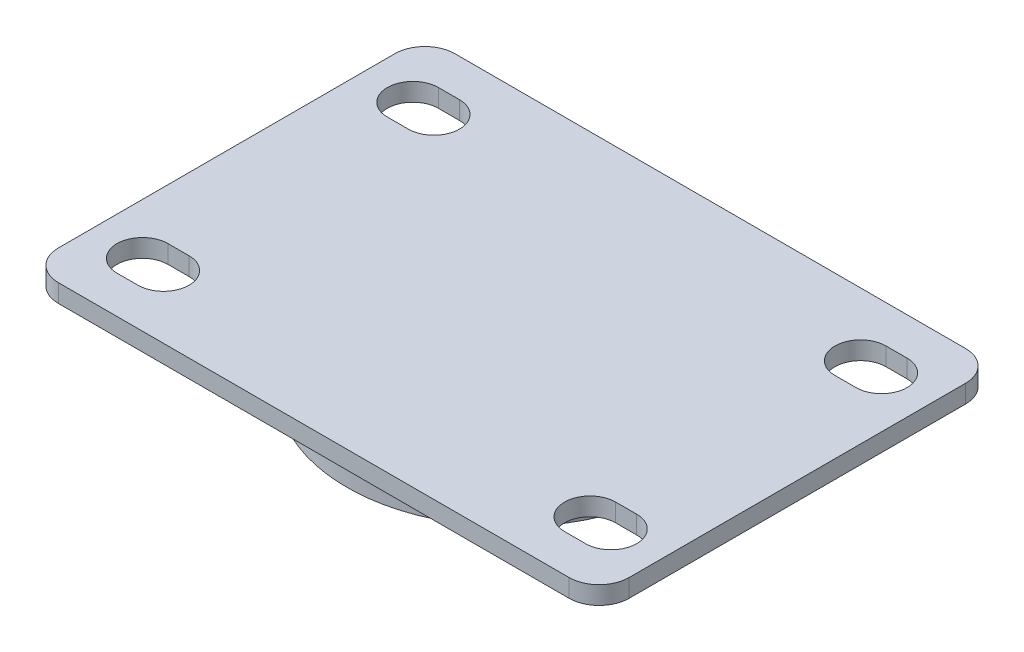
ISO-10303-21;
HEADER;
FILE_DESCRIPTION(('STEP AP214'),'2;1');
FILE_NAME('part.step','',(''),(''),'','','');
FILE_SCHEMA(('AUTOMOTIVE_DESIGN { 1 0 10303 214 1 1 1 1 }'));
ENDSEC;
DATA;
#1=APPLICATION_CONTEXT('core data for automotive mechanical design processes');
#2=APPLICATION_PROTOCOL_DEFINITION('international standard','automotive_design',2000,#1);
#3=PRODUCT_CONTEXT('',#1,'mechanical');
#4=PRODUCT('Part','Part','',(#3));
#5=PRODUCT_RELATED_PRODUCT_CATEGORY('part','',(#4));
#6=PRODUCT_DEFINITION_FORMATION('','',#4);
#7=PRODUCT_DEFINITION_CONTEXT('part definition',#1,'design');
#8=PRODUCT_DEFINITION('design','',#6,#7);
#9=PRODUCT_DEFINITION_SHAPE('','',#8);
#10=(LENGTH_UNIT() NAMED_UNIT(*) SI_UNIT(.MILLI.,.METRE.));
#11=(NAMED_UNIT(*) PLANE_ANGLE_UNIT() SI_UNIT($,.RADIAN.));
#12=(NAMED_UNIT(*) SI_UNIT($,.STERADIAN.) SOLID_ANGLE_UNIT());
#13=UNCERTAINTY_MEASURE_WITH_UNIT(LENGTH_MEASURE(1.E-05),#10,'distance_accuracy_value','');
#14=(GEOMETRIC_REPRESENTATION_CONTEXT(3) GLOBAL_UNCERTAINTY_ASSIGNED_CONTEXT((#13)) GLOBAL_UNIT_ASSIGNED_CONTEXT((#10,
#11,#12)) REPRESENTATION_CONTEXT('',''));
#15=CARTESIAN_POINT('',(0.,0.,0.));
#16=DIRECTION('',(0.,0.,1.));
#17=DIRECTION('',(1.,0.,0.));
#18=AXIS2_PLACEMENT_3D('',#15,#16,#17);
#19=CARTESIAN_POINT('',(0.,0.,0.));
#20=DIRECTION('',(0.,-1.,0.));
#21=DIRECTION('',(0.,0.,-1.));
#22=AXIS2_PLACEMENT_3D('',#19,#20,#21);
#23=PLANE('',#22);
#24=CARTESIAN_POINT('',(0.,0.,0.));
#25=DIRECTION('',(0.,-1.,0.));
#26=DIRECTION('',(0.,0.,-1.));
#27=AXIS2_PLACEMENT_3D('',#24,#25,#26);
#28=CIRCLE('',#27,23.5);
#29=CARTESIAN_POINT('',(0.,0.,-23.5));
#30=VERTEX_POINT('',#29);
#31=EDGE_CURVE('E208',#30,#30,#28,.F.);
#32=ORIENTED_EDGE('',*,*,#31,.T.);
#33=EDGE_LOOP('',(#32));
#34=FACE_BOUND('',#33,.T.);
#35=CARTESIAN_POINT('',(39.,0.,-22.5));
#36=DIRECTION('',(0.,1.,0.));
#37=DIRECTION('',(-1.,0.,0.));
#38=AXIS2_PLACEMENT_3D('',#35,#36,#37);
#39=CIRCLE('',#38,4.25000000000009);
#40=CARTESIAN_POINT('',(39.,0.,-18.25));
#41=VERTEX_POINT('',#40);
#42=CARTESIAN_POINT('',(39.,0.,-26.75));
#43=VERTEX_POINT('',#42);
#44=EDGE_CURVE('E292',#41,#43,#39,.T.);
#45=ORIENTED_EDGE('',*,*,#44,.T.);
#46=DIRECTION('',(-1.,0.,0.));
#47=VECTOR('',#46,1.);
#48=CARTESIAN_POINT('',(39.,0.,-26.75));
#49=LINE('',#48,#47);
#50=CARTESIAN_POINT('',(35.5,0.,-26.75));
#51=VERTEX_POINT('',#50);
#52=EDGE_CURVE('E45',#43,#51,#49,.T.);
#53=ORIENTED_EDGE('',*,*,#52,.T.);
#54=CARTESIAN_POINT('',(35.5,0.,-22.5));
#55=DIRECTION('',(0.,1.,0.));
#56=DIRECTION('',(1.,0.,0.));
#57=AXIS2_PLACEMENT_3D('',#54,#55,#56);
#58=CIRCLE('',#57,4.25000000000009);
#59=CARTESIAN_POINT('',(35.5,0.,-18.25));
#60=VERTEX_POINT('',#59);
#61=EDGE_CURVE('E284',#51,#60,#58,.T.);
#62=ORIENTED_EDGE('',*,*,#61,.T.);
#63=DIRECTION('',(1.,0.,0.));
#64=VECTOR('',#63,1.);
#65=CARTESIAN_POINT('',(35.5,0.,-18.25));
#66=LINE('',#65,#64);
#67=EDGE_CURVE('E288',#60,#41,#66,.T.);
#68=ORIENTED_EDGE('',*,*,#67,.T.);
#69=EDGE_LOOP('',(#45,#53,#62,#68));
#70=FACE_BOUND('',#69,.T.);
#71=CARTESIAN_POINT('',(-35.5,0.,-22.5));
#72=DIRECTION('',(0.,1.,0.));
#73=DIRECTION('',(-1.,0.,0.));
#74=AXIS2_PLACEMENT_3D('',#71,#72,#73);
#75=CIRCLE('',#74,4.25);
#76=CARTESIAN_POINT('',(-35.5,0.,-18.25));
#77=VERTEX_POINT('',#76);
#78=CARTESIAN_POINT('',(-35.5,0.,-26.75));
#79=VERTEX_POINT('',#78);
#80=EDGE_CURVE('E315',#77,#79,#75,.T.);
#81=ORIENTED_EDGE('',*,*,#80,.T.);
#82=DIRECTION('',(-1.,0.,0.));
#83=VECTOR('',#82,1.);
#84=CARTESIAN_POINT('',(-35.5,0.,-26.75));
#85=LINE('',#84,#83);
#86=CARTESIAN_POINT('',(-39.,0.,-26.75));
#87=VERTEX_POINT('',#86);
#88=EDGE_CURVE('E306',#79,#87,#85,.T.);
#89=ORIENTED_EDGE('',*,*,#88,.T.);
#90=CARTESIAN_POINT('',(-39.,0.,-22.5));
#91=DIRECTION('',(0.,1.,0.));
#92=DIRECTION('',(1.,0.,0.));
#93=AXIS2_PLACEMENT_3D('',#90,#91,#92);
#94=CIRCLE('',#93,4.25);
#95=CARTESIAN_POINT('',(-39.,0.,-18.25));
#96=VERTEX_POINT('',#95);
#97=EDGE_CURVE('E307',#87,#96,#94,.T.);
#98=ORIENTED_EDGE('',*,*,#97,.T.);
#99=DIRECTION('',(1.,0.,0.));
#100=VECTOR('',#99,1.);
#101=CARTESIAN_POINT('',(-39.,0.,-18.25));
#102=LINE('',#101,#100);
#103=EDGE_CURVE('E311',#96,#77,#102,.T.);
#104=ORIENTED_EDGE('',*,*,#103,.T.);
#105=EDGE_LOOP('',(#81,#89,#98,#104));
#106=FACE_BOUND('',#105,.T.);
#107=CARTESIAN_POINT('',(-35.5,0.,22.5));
#108=DIRECTION('',(0.,1.,0.));
#109=DIRECTION('',(-1.,0.,0.));
#110=AXIS2_PLACEMENT_3D('',#107,#108,#109);
#111=CIRCLE('',#110,4.25);
#112=CARTESIAN_POINT('',(-35.5,0.,26.75));
#113=VERTEX_POINT('',#112);
#114=CARTESIAN_POINT('',(-35.5,0.,18.25));
#115=VERTEX_POINT('',#114);
#116=EDGE_CURVE('E340',#113,#115,#111,.T.);
#117=ORIENTED_EDGE('',*,*,#116,.T.);
#118=DIRECTION('',(-1.,0.,0.));
#119=VECTOR('',#118,1.);
#120=CARTESIAN_POINT('',(-35.5,0.,18.25));
#121=LINE('',#120,#119);
#122=CARTESIAN_POINT('',(-39.,0.,18.25));
#123=VERTEX_POINT('',#122);
#124=EDGE_CURVE('E331',#115,#123,#121,.T.);
#125=ORIENTED_EDGE('',*,*,#124,.T.);
#126=CARTESIAN_POINT('',(-39.,0.,22.5));
#127=DIRECTION('',(0.,1.,0.));
#128=DIRECTION('',(1.,0.,0.));
#129=AXIS2_PLACEMENT_3D('',#126,#127,#128);
#130=CIRCLE('',#129,4.25);
#131=CARTESIAN_POINT('',(-39.,0.,26.75));
#132=VERTEX_POINT('',#131);
#133=EDGE_CURVE('E332',#123,#132,#130,.T.);
#134=ORIENTED_EDGE('',*,*,#133,.T.);
#135=DIRECTION('',(1.,0.,0.));
#136=VECTOR('',#135,1.);
#137=CARTESIAN_POINT('',(-39.,0.,26.75));
#138=LINE('',#137,#136);
#139=EDGE_CURVE('E336',#132,#113,#138,.T.);
#140=ORIENTED_EDGE('',*,*,#139,.T.);
#141=EDGE_LOOP('',(#117,#125,#134,#140));
#142=FACE_BOUND('',#141,.T.);
#143=DIRECTION('',(-1.,0.,0.));
#144=VECTOR('',#143,1.);
#145=CARTESIAN_POINT('',(20.,0.,33.));
#146=LINE('',#145,#144);
#147=CARTESIAN_POINT('',(42.5,0.,33.));
#148=VERTEX_POINT('',#147);
#149=CARTESIAN_POINT('',(-42.5,0.,33.));
#150=VERTEX_POINT('',#149);
#151=EDGE_CURVE('E360',#148,#150,#146,.T.);
#152=ORIENTED_EDGE('',*,*,#151,.T.);
#153=CARTESIAN_POINT('',(-42.5,0.,28.));
#154=DIRECTION('',(0.,-1.,0.));
#155=DIRECTION('',(0.,0.,-1.));
#156=AXIS2_PLACEMENT_3D('',#153,#154,#155);
#157=CIRCLE('',#156,5.);
#158=CARTESIAN_POINT('',(-47.5,0.,28.));
#159=VERTEX_POINT('',#158);
#160=EDGE_CURVE('E29',#150,#159,#157,.T.);
#161=ORIENTED_EDGE('',*,*,#160,.T.);
#162=DIRECTION('',(0.,0.,-1.));
#163=VECTOR('',#162,1.);
#164=CARTESIAN_POINT('',(-47.5,0.,15.));
#165=LINE('',#164,#163);
#166=CARTESIAN_POINT('',(-47.5,0.,-28.));
#167=VERTEX_POINT('',#166);
#168=EDGE_CURVE('E188',#159,#167,#165,.T.);
#169=ORIENTED_EDGE('',*,*,#168,.T.);
#170=CARTESIAN_POINT('',(-42.5,0.,-28.));
#171=DIRECTION('',(0.,-1.,0.));
#172=DIRECTION('',(0.,0.,-1.));
#173=AXIS2_PLACEMENT_3D('',#170,#171,#172);
#174=CIRCLE('',#173,5.);
#175=CARTESIAN_POINT('',(-42.5,0.,-33.));
#176=VERTEX_POINT('',#175);
#177=EDGE_CURVE('E366',#167,#176,#174,.T.);
#178=ORIENTED_EDGE('',*,*,#177,.T.);
#179=DIRECTION('',(1.,0.,0.));
#180=VECTOR('',#179,1.);
#181=CARTESIAN_POINT('',(-20.,0.,-33.));
#182=LINE('',#181,#180);
#183=CARTESIAN_POINT('',(42.5,0.,-33.));
#184=VERTEX_POINT('',#183);
#185=EDGE_CURVE('E356',#176,#184,#182,.T.);
#186=ORIENTED_EDGE('',*,*,#185,.T.);
#187=CARTESIAN_POINT('',(42.5,0.,-28.));
#188=DIRECTION('',(0.,-1.,0.));
#189=DIRECTION('',(0.,0.,-1.));
#190=AXIS2_PLACEMENT_3D('',#187,#188,#189);
#191=CIRCLE('',#190,5.);
#192=CARTESIAN_POINT('',(47.5,0.,-28.));
#193=VERTEX_POINT('',#192);
#194=EDGE_CURVE('E370',#184,#193,#191,.T.);
#195=ORIENTED_EDGE('',*,*,#194,.T.);
#196=DIRECTION('',(0.,0.,1.));
#197=VECTOR('',#196,1.);
#198=CARTESIAN_POINT('',(47.5,0.,-15.));
#199=LINE('',#198,#197);
#200=CARTESIAN_POINT('',(47.5,0.,28.));
#201=VERTEX_POINT('',#200);
#202=EDGE_CURVE('E357',#193,#201,#199,.T.);
#203=ORIENTED_EDGE('',*,*,#202,.T.);
#204=CARTESIAN_POINT('',(42.5,0.,28.));
#205=DIRECTION('',(0.,-1.,0.));
#206=DIRECTION('',(0.,0.,-1.));
#207=AXIS2_PLACEMENT_3D('',#204,#205,#206);
#208=CIRCLE('',#207,5.);
#209=EDGE_CURVE('E382',#201,#148,#208,.T.);
#210=ORIENTED_EDGE('',*,*,#209,.T.);
#211=EDGE_LOOP('',(#152,#161,#169,#178,#186,#195,#203,#210));
#212=FACE_BOUND('',#211,.T.);
#213=DIRECTION('',(-1.,0.,0.));
#214=VECTOR('',#213,1.);
#215=CARTESIAN_POINT('',(39.,0.,18.25));
#216=LINE('',#215,#214);
#217=CARTESIAN_POINT('',(39.,0.,18.25));
#218=VERTEX_POINT('',#217);
#219=CARTESIAN_POINT('',(35.5,0.,18.25));
#220=VERTEX_POINT('',#219);
#221=EDGE_CURVE('E270',#218,#220,#216,.T.);
#222=ORIENTED_EDGE('',*,*,#221,.T.);
#223=CARTESIAN_POINT('',(35.5,0.,22.5));
#224=DIRECTION('',(0.,1.,0.));
#225=DIRECTION('',(1.,0.,0.));
#226=AXIS2_PLACEMENT_3D('',#223,#224,#225);
#227=CIRCLE('',#226,4.25);
#228=CARTESIAN_POINT('',(35.5,0.,26.75));
#229=VERTEX_POINT('',#228);
#230=EDGE_CURVE('E37',#220,#229,#227,.T.);
#231=ORIENTED_EDGE('',*,*,#230,.T.);
#232=DIRECTION('',(1.,0.,0.));
#233=VECTOR('',#232,1.);
#234=CARTESIAN_POINT('',(35.5,0.,26.75));
#235=LINE('',#234,#233);
#236=CARTESIAN_POINT('',(39.,0.,26.75));
#237=VERTEX_POINT('',#236);
#238=EDGE_CURVE('E262',#229,#237,#235,.T.);
#239=ORIENTED_EDGE('',*,*,#238,.T.);
#240=CARTESIAN_POINT('',(39.,0.,22.5));
#241=DIRECTION('',(0.,1.,0.));
#242=DIRECTION('',(-1.,0.,0.));
#243=AXIS2_PLACEMENT_3D('',#240,#241,#242);
#244=CIRCLE('',#243,4.25);
#245=EDGE_CURVE('E266',#237,#218,#244,.T.);
#246=ORIENTED_EDGE('',*,*,#245,.T.);
#247=EDGE_LOOP('',(#222,#231,#239,#246));
#248=FACE_BOUND('',#247,.T.);
#249=ADVANCED_FACE('F20',(#34,#70,#106,#142,#212,#248),#23,.T.);
#250=CARTESIAN_POINT('',(-20.,1.,-33.));
#251=DIRECTION('',(0.,0.,-1.));
#252=DIRECTION('',(-1.,0.,0.));
#253=AXIS2_PLACEMENT_3D('',#250,#251,#252);
#254=PLANE('',#253);
#255=ORIENTED_EDGE('',*,*,#185,.F.);
#256=DIRECTION('',(0.,-1.,0.));
#257=VECTOR('',#256,1.);
#258=CARTESIAN_POINT('',(-42.5,1.,-33.));
#259=LINE('',#258,#257);
#260=CARTESIAN_POINT('',(-42.5,3.,-33.));
#261=VERTEX_POINT('',#260);
#262=EDGE_CURVE('E364',#176,#261,#259,.F.);
#263=ORIENTED_EDGE('',*,*,#262,.T.);
#264=DIRECTION('',(1.,0.,0.));
#265=VECTOR('',#264,1.);
#266=CARTESIAN_POINT('',(-42.5,3.,-33.));
#267=LINE('',#266,#265);
#268=CARTESIAN_POINT('',(42.5,3.,-33.));
#269=VERTEX_POINT('',#268);
#270=EDGE_CURVE('E1007',#261,#269,#267,.T.);
#271=ORIENTED_EDGE('',*,*,#270,.T.);
#272=DIRECTION('',(0.,-1.,0.));
#273=VECTOR('',#272,1.);
#274=CARTESIAN_POINT('',(42.5,1.,-33.));
#275=LINE('',#274,#273);
#276=EDGE_CURVE('E367',#269,#184,#275,.T.);
#277=ORIENTED_EDGE('',*,*,#276,.T.);
#278=EDGE_LOOP('',(#255,#263,#271,#277));
#279=FACE_BOUND('',#278,.T.);
#280=ADVANCED_FACE('F422',(#279),#254,.T.);
#281=CARTESIAN_POINT('',(47.5,1.,-15.));
#282=DIRECTION('',(1.,0.,0.));
#283=DIRECTION('',(0.,0.,-1.));
#284=AXIS2_PLACEMENT_3D('',#281,#282,#283);
#285=PLANE('',#284);
#286=ORIENTED_EDGE('',*,*,#202,.F.);
#287=DIRECTION('',(0.,-1.,0.));
#288=VECTOR('',#287,1.);
#289=CARTESIAN_POINT('',(47.5,1.,-28.));
#290=LINE('',#289,#288);
#291=CARTESIAN_POINT('',(47.5,3.,-28.));
#292=VERTEX_POINT('',#291);
#293=EDGE_CURVE('E375',#193,#292,#290,.F.);
#294=ORIENTED_EDGE('',*,*,#293,.T.);
#295=DIRECTION('',(0.,0.,1.));
#296=VECTOR('',#295,1.);
#297=CARTESIAN_POINT('',(47.5,3.,-28.));
#298=LINE('',#297,#296);
#299=CARTESIAN_POINT('',(47.5,3.,28.));
#300=VERTEX_POINT('',#299);
#301=EDGE_CURVE('E1001',#292,#300,#298,.T.);
#302=ORIENTED_EDGE('',*,*,#301,.T.);
#303=DIRECTION('',(0.,1.,0.));
#304=VECTOR('',#303,1.);
#305=CARTESIAN_POINT('',(47.5,1.,28.));
#306=LINE('',#305,#304);
#307=EDGE_CURVE('E363',#300,#201,#306,.F.);
#308=ORIENTED_EDGE('',*,*,#307,.T.);
#309=EDGE_LOOP('',(#286,#294,#302,#308));
#310=FACE_BOUND('',#309,.T.);
#311=ADVANCED_FACE('F428',(#310),#285,.T.);
#312=CARTESIAN_POINT('',(20.,1.,33.));
#313=DIRECTION('',(0.,0.,1.));
#314=DIRECTION('',(1.,0.,0.));
#315=AXIS2_PLACEMENT_3D('',#312,#313,#314);
#316=PLANE('',#315);
#317=DIRECTION('',(0.,1.,0.));
#318=VECTOR('',#317,1.);
#319=CARTESIAN_POINT('',(42.5,1.,33.));
#320=LINE('',#319,#318);
#321=CARTESIAN_POINT('',(42.5,3.,33.));
#322=VERTEX_POINT('',#321);
#323=EDGE_CURVE('E371',#148,#322,#320,.T.);
#324=ORIENTED_EDGE('',*,*,#323,.T.);
#325=DIRECTION('',(-1.,0.,0.));
#326=VECTOR('',#325,1.);
#327=CARTESIAN_POINT('',(42.5,3.,33.));
#328=LINE('',#327,#326);
#329=CARTESIAN_POINT('',(-42.5,3.,33.));
#330=VERTEX_POINT('',#329);
#331=EDGE_CURVE('E212',#322,#330,#328,.T.);
#332=ORIENTED_EDGE('',*,*,#331,.T.);
#333=DIRECTION('',(0.,-1.,0.));
#334=VECTOR('',#333,1.);
#335=CARTESIAN_POINT('',(-42.5,1.,33.));
#336=LINE('',#335,#334);
#337=EDGE_CURVE('E203',#330,#150,#336,.T.);
#338=ORIENTED_EDGE('',*,*,#337,.T.);
#339=ORIENTED_EDGE('',*,*,#151,.F.);
#340=EDGE_LOOP('',(#324,#332,#338,#339));
#341=FACE_BOUND('',#340,.T.);
#342=ADVANCED_FACE('F438',(#341),#316,.T.);
#343=CARTESIAN_POINT('',(-47.5,1.,15.));
#344=DIRECTION('',(-1.,0.,0.));
#345=DIRECTION('',(0.,0.,1.));
#346=AXIS2_PLACEMENT_3D('',#343,#344,#345);
#347=PLANE('',#346);
#348=ORIENTED_EDGE('',*,*,#168,.F.);
#349=DIRECTION('',(0.,-1.,0.));
#350=VECTOR('',#349,1.);
#351=CARTESIAN_POINT('',(-47.5,1.,28.));
#352=LINE('',#351,#350);
#353=CARTESIAN_POINT('',(-47.5,3.,28.));
#354=VERTEX_POINT('',#353);
#355=EDGE_CURVE('E12',#159,#354,#352,.F.);
#356=ORIENTED_EDGE('',*,*,#355,.T.);
#357=DIRECTION('',(0.,0.,-1.));
#358=VECTOR('',#357,1.);
#359=CARTESIAN_POINT('',(-47.5,3.,28.));
#360=LINE('',#359,#358);
#361=CARTESIAN_POINT('',(-47.5,3.,-28.));
#362=VERTEX_POINT('',#361);
#363=EDGE_CURVE('E186',#354,#362,#360,.T.);
#364=ORIENTED_EDGE('',*,*,#363,.T.);
#365=DIRECTION('',(0.,-1.,0.));
#366=VECTOR('',#365,1.);
#367=CARTESIAN_POINT('',(-47.5,1.,-28.));
#368=LINE('',#367,#366);
#369=EDGE_CURVE('E377',#362,#167,#368,.T.);
#370=ORIENTED_EDGE('',*,*,#369,.T.);
#371=EDGE_LOOP('',(#348,#356,#364,#370));
#372=FACE_BOUND('',#371,.T.);
#373=ADVANCED_FACE('F184',(#372),#347,.T.);
#374=CARTESIAN_POINT('',(42.5,1.,28.));
#375=DIRECTION('',(0.,1.,0.));
#376=DIRECTION('',(0.,0.,1.));
#377=AXIS2_PLACEMENT_3D('',#374,#375,#376);
#378=CYLINDRICAL_SURFACE('',#377,5.);
#379=ORIENTED_EDGE('',*,*,#307,.F.);
#380=CARTESIAN_POINT('',(42.5,3.,28.));
#381=DIRECTION('',(0.,-1.,0.));
#382=DIRECTION('',(0.,0.,-1.));
#383=AXIS2_PLACEMENT_3D('',#380,#381,#382);
#384=CIRCLE('',#383,5.);
#385=EDGE_CURVE('E998',#300,#322,#384,.T.);
#386=ORIENTED_EDGE('',*,*,#385,.T.);
#387=ORIENTED_EDGE('',*,*,#323,.F.);
#388=ORIENTED_EDGE('',*,*,#209,.F.);
#389=EDGE_LOOP('',(#379,#386,#387,#388));
#390=FACE_BOUND('',#389,.T.);
#391=ADVANCED_FACE('F441',(#390),#378,.T.);
#392=CARTESIAN_POINT('',(42.5,1.,-28.));
#393=DIRECTION('',(0.,-1.,0.));
#394=DIRECTION('',(0.,0.,-1.));
#395=AXIS2_PLACEMENT_3D('',#392,#393,#394);
#396=CYLINDRICAL_SURFACE('',#395,5.);
#397=ORIENTED_EDGE('',*,*,#276,.F.);
#398=CARTESIAN_POINT('',(42.5,3.,-28.));
#399=DIRECTION('',(0.,-1.,0.));
#400=DIRECTION('',(0.,0.,1.));
#401=AXIS2_PLACEMENT_3D('',#398,#399,#400);
#402=CIRCLE('',#401,5.);
#403=EDGE_CURVE('E1002',#269,#292,#402,.T.);
#404=ORIENTED_EDGE('',*,*,#403,.T.);
#405=ORIENTED_EDGE('',*,*,#293,.F.);
#406=ORIENTED_EDGE('',*,*,#194,.F.);
#407=EDGE_LOOP('',(#397,#404,#405,#406));
#408=FACE_BOUND('',#407,.T.);
#409=ADVANCED_FACE('F443',(#408),#396,.T.);
#410=CARTESIAN_POINT('',(-42.5,1.,-28.));
#411=DIRECTION('',(0.,-1.,0.));
#412=DIRECTION('',(0.,0.,-1.));
#413=AXIS2_PLACEMENT_3D('',#410,#411,#412);
#414=CYLINDRICAL_SURFACE('',#413,5.);
#415=ORIENTED_EDGE('',*,*,#369,.F.);
#416=CARTESIAN_POINT('',(-42.5,3.,-28.));
#417=DIRECTION('',(0.,-1.,0.));
#418=DIRECTION('',(0.,0.,1.));
#419=AXIS2_PLACEMENT_3D('',#416,#417,#418);
#420=CIRCLE('',#419,5.);
#421=EDGE_CURVE('E199',#362,#261,#420,.T.);
#422=ORIENTED_EDGE('',*,*,#421,.T.);
#423=ORIENTED_EDGE('',*,*,#262,.F.);
#424=ORIENTED_EDGE('',*,*,#177,.F.);
#425=EDGE_LOOP('',(#415,#422,#423,#424));
#426=FACE_BOUND('',#425,.T.);
#427=ADVANCED_FACE('F446',(#426),#414,.T.);
#428=CARTESIAN_POINT('',(-42.5,1.,28.));
#429=DIRECTION('',(0.,-1.,0.));
#430=DIRECTION('',(0.,0.,-1.));
#431=AXIS2_PLACEMENT_3D('',#428,#429,#430);
#432=CYLINDRICAL_SURFACE('',#431,5.);
#433=ORIENTED_EDGE('',*,*,#337,.F.);
#434=CARTESIAN_POINT('',(-42.5,3.,28.));
#435=DIRECTION('',(0.,-1.,0.));
#436=DIRECTION('',(0.,0.,-1.));
#437=AXIS2_PLACEMENT_3D('',#434,#435,#436);
#438=CIRCLE('',#437,5.);
#439=EDGE_CURVE('E196',#330,#354,#438,.T.);
#440=ORIENTED_EDGE('',*,*,#439,.T.);
#441=ORIENTED_EDGE('',*,*,#355,.F.);
#442=ORIENTED_EDGE('',*,*,#160,.F.);
#443=EDGE_LOOP('',(#433,#440,#441,#442));
#444=FACE_BOUND('',#443,.T.);
#445=ADVANCED_FACE('F201',(#444),#432,.T.);
#446=CARTESIAN_POINT('',(-35.5,17.2287310847366,18.25));
#447=DIRECTION('',(0.,0.,1.));
#448=DIRECTION('',(1.,0.,0.));
#449=AXIS2_PLACEMENT_3D('',#446,#447,#448);
#450=PLANE('',#449);
#451=DIRECTION('',(0.,-1.,0.));
#452=VECTOR('',#451,1.);
#453=CARTESIAN_POINT('',(-35.5,17.2287310847366,18.25));
#454=LINE('',#453,#452);
#455=CARTESIAN_POINT('',(-35.5,3.,18.25));
#456=VERTEX_POINT('',#455);
#457=EDGE_CURVE('E344',#456,#115,#454,.T.);
#458=ORIENTED_EDGE('',*,*,#457,.F.);
#459=DIRECTION('',(-1.,0.,0.));
#460=VECTOR('',#459,1.);
#461=CARTESIAN_POINT('',(-35.5,3.,18.25));
#462=LINE('',#461,#460);
#463=CARTESIAN_POINT('',(-39.,3.,18.25));
#464=VERTEX_POINT('',#463);
#465=EDGE_CURVE('E220',#456,#464,#462,.T.);
#466=ORIENTED_EDGE('',*,*,#465,.T.);
#467=DIRECTION('',(0.,-1.,0.));
#468=VECTOR('',#467,1.);
#469=CARTESIAN_POINT('',(-39.,17.2287310847366,18.25));
#470=LINE('',#469,#468);
#471=EDGE_CURVE('E354',#464,#123,#470,.T.);
#472=ORIENTED_EDGE('',*,*,#471,.T.);
#473=ORIENTED_EDGE('',*,*,#124,.F.);
#474=EDGE_LOOP('',(#458,#466,#472,#473));
#475=FACE_BOUND('',#474,.T.);
#476=ADVANCED_FACE('F434',(#475),#450,.T.);
#477=CARTESIAN_POINT('',(-39.,17.2287310847366,22.5));
#478=DIRECTION('',(0.,-1.,0.));
#479=DIRECTION('',(0.,0.,-1.));
#480=AXIS2_PLACEMENT_3D('',#477,#478,#479);
#481=CYLINDRICAL_SURFACE('',#480,4.25);
#482=ORIENTED_EDGE('',*,*,#471,.F.);
#483=CARTESIAN_POINT('',(-39.,3.,22.5));
#484=DIRECTION('',(0.,1.,0.));
#485=DIRECTION('',(0.,0.,-1.));
#486=AXIS2_PLACEMENT_3D('',#483,#484,#485);
#487=CIRCLE('',#486,4.25);
#488=CARTESIAN_POINT('',(-39.,3.,26.75));
#489=VERTEX_POINT('',#488);
#490=EDGE_CURVE('E217',#464,#489,#487,.T.);
#491=ORIENTED_EDGE('',*,*,#490,.T.);
#492=DIRECTION('',(0.,-1.,0.));
#493=VECTOR('',#492,1.);
#494=CARTESIAN_POINT('',(-39.,17.2287310847366,26.75));
#495=LINE('',#494,#493);
#496=EDGE_CURVE('E352',#489,#132,#495,.T.);
#497=ORIENTED_EDGE('',*,*,#496,.T.);
#498=ORIENTED_EDGE('',*,*,#133,.F.);
#499=EDGE_LOOP('',(#482,#491,#497,#498));
#500=FACE_BOUND('',#499,.T.);
#501=ADVANCED_FACE('F460',(#500),#481,.F.);
#502=CARTESIAN_POINT('',(-39.,17.2287310847366,26.75));
#503=DIRECTION('',(0.,0.,-1.));
#504=DIRECTION('',(-1.,0.,0.));
#505=AXIS2_PLACEMENT_3D('',#502,#503,#504);
#506=PLANE('',#505);
#507=ORIENTED_EDGE('',*,*,#496,.F.);
#508=DIRECTION('',(1.,0.,0.));
#509=VECTOR('',#508,1.);
#510=CARTESIAN_POINT('',(-39.,3.,26.75));
#511=LINE('',#510,#509);
#512=CARTESIAN_POINT('',(-35.5,3.,26.75));
#513=VERTEX_POINT('',#512);
#514=EDGE_CURVE('E214',#489,#513,#511,.T.);
#515=ORIENTED_EDGE('',*,*,#514,.T.);
#516=DIRECTION('',(0.,-1.,0.));
#517=VECTOR('',#516,1.);
#518=CARTESIAN_POINT('',(-35.5,17.2287310847366,26.75));
#519=LINE('',#518,#517);
#520=EDGE_CURVE('E350',#513,#113,#519,.T.);
#521=ORIENTED_EDGE('',*,*,#520,.T.);
#522=ORIENTED_EDGE('',*,*,#139,.F.);
#523=EDGE_LOOP('',(#507,#515,#521,#522));
#524=FACE_BOUND('',#523,.T.);
#525=ADVANCED_FACE('F465',(#524),#506,.T.);
#526=CARTESIAN_POINT('',(-35.5,17.2287310847366,22.5));
#527=DIRECTION('',(0.,-1.,0.));
#528=DIRECTION('',(0.,0.,-1.));
#529=AXIS2_PLACEMENT_3D('',#526,#527,#528);
#530=CYLINDRICAL_SURFACE('',#529,4.25);
#531=ORIENTED_EDGE('',*,*,#520,.F.);
#532=CARTESIAN_POINT('',(-35.5,3.,22.5));
#533=DIRECTION('',(0.,1.,0.));
#534=DIRECTION('',(0.,0.,1.));
#535=AXIS2_PLACEMENT_3D('',#532,#533,#534);
#536=CIRCLE('',#535,4.25);
#537=EDGE_CURVE('E223',#513,#456,#536,.T.);
#538=ORIENTED_EDGE('',*,*,#537,.T.);
#539=ORIENTED_EDGE('',*,*,#457,.T.);
#540=ORIENTED_EDGE('',*,*,#116,.F.);
#541=EDGE_LOOP('',(#531,#538,#539,#540));
#542=FACE_BOUND('',#541,.T.);
#543=ADVANCED_FACE('F472',(#542),#530,.F.);
#544=CARTESIAN_POINT('',(-35.5,17.2287310847366,-26.75));
#545=DIRECTION('',(0.,0.,1.));
#546=DIRECTION('',(1.,0.,0.));
#547=AXIS2_PLACEMENT_3D('',#544,#545,#546);
#548=PLANE('',#547);
#549=DIRECTION('',(0.,-1.,0.));
#550=VECTOR('',#549,1.);
#551=CARTESIAN_POINT('',(-35.5,17.2287310847366,-26.75));
#552=LINE('',#551,#550);
#553=CARTESIAN_POINT('',(-35.5,3.,-26.75));
#554=VERTEX_POINT('',#553);
#555=EDGE_CURVE('E319',#554,#79,#552,.T.);
#556=ORIENTED_EDGE('',*,*,#555,.F.);
#557=DIRECTION('',(-1.,0.,0.));
#558=VECTOR('',#557,1.);
#559=CARTESIAN_POINT('',(-35.5,3.,-26.75));
#560=LINE('',#559,#558);
#561=CARTESIAN_POINT('',(-39.,3.,-26.75));
#562=VERTEX_POINT('',#561);
#563=EDGE_CURVE('E232',#554,#562,#560,.T.);
#564=ORIENTED_EDGE('',*,*,#563,.T.);
#565=DIRECTION('',(0.,-1.,0.));
#566=VECTOR('',#565,1.);
#567=CARTESIAN_POINT('',(-39.,17.2287310847366,-26.75));
#568=LINE('',#567,#566);
#569=EDGE_CURVE('E329',#562,#87,#568,.T.);
#570=ORIENTED_EDGE('',*,*,#569,.T.);
#571=ORIENTED_EDGE('',*,*,#88,.F.);
#572=EDGE_LOOP('',(#556,#564,#570,#571));
#573=FACE_BOUND('',#572,.T.);
#574=ADVANCED_FACE('F485',(#573),#548,.T.);
#575=CARTESIAN_POINT('',(-39.,17.2287310847366,-22.5));
#576=DIRECTION('',(0.,-1.,0.));
#577=DIRECTION('',(0.,0.,-1.));
#578=AXIS2_PLACEMENT_3D('',#575,#576,#577);
#579=CYLINDRICAL_SURFACE('',#578,4.25);
#580=ORIENTED_EDGE('',*,*,#569,.F.);
#581=CARTESIAN_POINT('',(-39.,3.,-22.5));
#582=DIRECTION('',(0.,1.,0.));
#583=DIRECTION('',(0.,0.,-1.));
#584=AXIS2_PLACEMENT_3D('',#581,#582,#583);
#585=CIRCLE('',#584,4.25);
#586=CARTESIAN_POINT('',(-39.,3.,-18.25));
#587=VERTEX_POINT('',#586);
#588=EDGE_CURVE('E229',#562,#587,#585,.T.);
#589=ORIENTED_EDGE('',*,*,#588,.T.);
#590=DIRECTION('',(0.,-1.,0.));
#591=VECTOR('',#590,1.);
#592=CARTESIAN_POINT('',(-39.,17.2287310847366,-18.25));
#593=LINE('',#592,#591);
#594=EDGE_CURVE('E327',#587,#96,#593,.T.);
#595=ORIENTED_EDGE('',*,*,#594,.T.);
#596=ORIENTED_EDGE('',*,*,#97,.F.);
#597=EDGE_LOOP('',(#580,#589,#595,#596));
#598=FACE_BOUND('',#597,.T.);
#599=ADVANCED_FACE('F490',(#598),#579,.F.);
#600=CARTESIAN_POINT('',(-39.,17.2287310847366,-18.25));
#601=DIRECTION('',(0.,0.,-1.));
#602=DIRECTION('',(-1.,0.,0.));
#603=AXIS2_PLACEMENT_3D('',#600,#601,#602);
#604=PLANE('',#603);
#605=ORIENTED_EDGE('',*,*,#594,.F.);
#606=DIRECTION('',(1.,0.,0.));
#607=VECTOR('',#606,1.);
#608=CARTESIAN_POINT('',(-39.,3.,-18.25));
#609=LINE('',#608,#607);
#610=CARTESIAN_POINT('',(-35.5,3.,-18.25));
#611=VERTEX_POINT('',#610);
#612=EDGE_CURVE('E226',#587,#611,#609,.T.);
#613=ORIENTED_EDGE('',*,*,#612,.T.);
#614=DIRECTION('',(0.,-1.,0.));
#615=VECTOR('',#614,1.);
#616=CARTESIAN_POINT('',(-35.5,17.2287310847366,-18.25));
#617=LINE('',#616,#615);
#618=EDGE_CURVE('E325',#611,#77,#617,.T.);
#619=ORIENTED_EDGE('',*,*,#618,.T.);
#620=ORIENTED_EDGE('',*,*,#103,.F.);
#621=EDGE_LOOP('',(#605,#613,#619,#620));
#622=FACE_BOUND('',#621,.T.);
#623=ADVANCED_FACE('F494',(#622),#604,.T.);
#624=CARTESIAN_POINT('',(-35.5,17.2287310847366,-22.5));
#625=DIRECTION('',(0.,-1.,0.));
#626=DIRECTION('',(0.,0.,-1.));
#627=AXIS2_PLACEMENT_3D('',#624,#625,#626);
#628=CYLINDRICAL_SURFACE('',#627,4.25);
#629=ORIENTED_EDGE('',*,*,#618,.F.);
#630=CARTESIAN_POINT('',(-35.5,3.,-22.5));
#631=DIRECTION('',(0.,1.,0.));
#632=DIRECTION('',(0.,0.,1.));
#633=AXIS2_PLACEMENT_3D('',#630,#631,#632);
#634=CIRCLE('',#633,4.25);
#635=EDGE_CURVE('E235',#611,#554,#634,.T.);
#636=ORIENTED_EDGE('',*,*,#635,.T.);
#637=ORIENTED_EDGE('',*,*,#555,.T.);
#638=ORIENTED_EDGE('',*,*,#80,.F.);
#639=EDGE_LOOP('',(#629,#636,#637,#638));
#640=FACE_BOUND('',#639,.T.);
#641=ADVANCED_FACE('F498',(#640),#628,.F.);
#642=CARTESIAN_POINT('',(39.,17.2287310847366,-26.75));
#643=DIRECTION('',(0.,0.,1.));
#644=DIRECTION('',(1.,0.,0.));
#645=AXIS2_PLACEMENT_3D('',#642,#643,#644);
#646=PLANE('',#645);
#647=DIRECTION('',(0.,-1.,0.));
#648=VECTOR('',#647,1.);
#649=CARTESIAN_POINT('',(39.,17.2287310847366,-26.75));
#650=LINE('',#649,#648);
#651=CARTESIAN_POINT('',(39.,3.,-26.75));
#652=VERTEX_POINT('',#651);
#653=EDGE_CURVE('E296',#652,#43,#650,.T.);
#654=ORIENTED_EDGE('',*,*,#653,.F.);
#655=DIRECTION('',(-1.,0.,0.));
#656=VECTOR('',#655,1.);
#657=CARTESIAN_POINT('',(39.,3.,-26.75));
#658=LINE('',#657,#656);
#659=CARTESIAN_POINT('',(35.5,3.,-26.75));
#660=VERTEX_POINT('',#659);
#661=EDGE_CURVE('E244',#652,#660,#658,.T.);
#662=ORIENTED_EDGE('',*,*,#661,.T.);
#663=DIRECTION('',(0.,-1.,0.));
#664=VECTOR('',#663,1.);
#665=CARTESIAN_POINT('',(35.5,17.2287310847366,-26.75));
#666=LINE('',#665,#664);
#667=EDGE_CURVE('E304',#660,#51,#666,.T.);
#668=ORIENTED_EDGE('',*,*,#667,.T.);
#669=ORIENTED_EDGE('',*,*,#52,.F.);
#670=EDGE_LOOP('',(#654,#662,#668,#669));
#671=FACE_BOUND('',#670,.T.);
#672=ADVANCED_FACE('F502',(#671),#646,.T.);
#673=CARTESIAN_POINT('',(35.5,17.2287310847366,-22.5));
#674=DIRECTION('',(0.,-1.,0.));
#675=DIRECTION('',(0.,0.,-1.));
#676=AXIS2_PLACEMENT_3D('',#673,#674,#675);
#677=CYLINDRICAL_SURFACE('',#676,4.25000000000009);
#678=ORIENTED_EDGE('',*,*,#667,.F.);
#679=CARTESIAN_POINT('',(35.5,3.,-22.5));
#680=DIRECTION('',(0.,1.,0.));
#681=DIRECTION('',(0.,0.,-1.));
#682=AXIS2_PLACEMENT_3D('',#679,#680,#681);
#683=CIRCLE('',#682,4.25000000000009);
#684=CARTESIAN_POINT('',(35.5,3.,-18.25));
#685=VERTEX_POINT('',#684);
#686=EDGE_CURVE('E241',#660,#685,#683,.T.);
#687=ORIENTED_EDGE('',*,*,#686,.T.);
#688=DIRECTION('',(0.,-1.,0.));
#689=VECTOR('',#688,1.);
#690=CARTESIAN_POINT('',(35.5,17.2287310847366,-18.25));
#691=LINE('',#690,#689);
#692=EDGE_CURVE('E302',#685,#60,#691,.T.);
#693=ORIENTED_EDGE('',*,*,#692,.T.);
#694=ORIENTED_EDGE('',*,*,#61,.F.);
#695=EDGE_LOOP('',(#678,#687,#693,#694));
#696=FACE_BOUND('',#695,.T.);
#697=ADVANCED_FACE('F506',(#696),#677,.F.);
#698=CARTESIAN_POINT('',(35.5,17.2287310847366,-18.25));
#699=DIRECTION('',(0.,0.,-1.));
#700=DIRECTION('',(-1.,0.,0.));
#701=AXIS2_PLACEMENT_3D('',#698,#699,#700);
#702=PLANE('',#701);
#703=ORIENTED_EDGE('',*,*,#692,.F.);
#704=DIRECTION('',(1.,0.,0.));
#705=VECTOR('',#704,1.);
#706=CARTESIAN_POINT('',(35.5,3.,-18.25));
#707=LINE('',#706,#705);
#708=CARTESIAN_POINT('',(39.,3.,-18.25));
#709=VERTEX_POINT('',#708);
#710=EDGE_CURVE('E238',#685,#709,#707,.T.);
#711=ORIENTED_EDGE('',*,*,#710,.T.);
#712=DIRECTION('',(0.,-1.,0.));
#713=VECTOR('',#712,1.);
#714=CARTESIAN_POINT('',(39.,17.2287310847366,-18.25));
#715=LINE('',#714,#713);
#716=EDGE_CURVE('E300',#709,#41,#715,.T.);
#717=ORIENTED_EDGE('',*,*,#716,.T.);
#718=ORIENTED_EDGE('',*,*,#67,.F.);
#719=EDGE_LOOP('',(#703,#711,#717,#718));
#720=FACE_BOUND('',#719,.T.);
#721=ADVANCED_FACE('F509',(#720),#702,.T.);
#722=CARTESIAN_POINT('',(39.,17.2287310847366,-22.5));
#723=DIRECTION('',(0.,-1.,0.));
#724=DIRECTION('',(0.,0.,-1.));
#725=AXIS2_PLACEMENT_3D('',#722,#723,#724);
#726=CYLINDRICAL_SURFACE('',#725,4.25000000000009);
#727=ORIENTED_EDGE('',*,*,#716,.F.);
#728=CARTESIAN_POINT('',(39.,3.,-22.5));
#729=DIRECTION('',(0.,1.,0.));
#730=DIRECTION('',(0.,0.,1.));
#731=AXIS2_PLACEMENT_3D('',#728,#729,#730);
#732=CIRCLE('',#731,4.25000000000009);
#733=EDGE_CURVE('E247',#709,#652,#732,.T.);
#734=ORIENTED_EDGE('',*,*,#733,.T.);
#735=ORIENTED_EDGE('',*,*,#653,.T.);
#736=ORIENTED_EDGE('',*,*,#44,.F.);
#737=EDGE_LOOP('',(#727,#734,#735,#736));
#738=FACE_BOUND('',#737,.T.);
#739=ADVANCED_FACE('F513',(#738),#726,.F.);
#740=CARTESIAN_POINT('',(35.5,17.2287310847366,22.5));
#741=DIRECTION('',(0.,-1.,0.));
#742=DIRECTION('',(0.,0.,-1.));
#743=AXIS2_PLACEMENT_3D('',#740,#741,#742);
#744=CYLINDRICAL_SURFACE('',#743,4.25);
#745=DIRECTION('',(0.,-1.,0.));
#746=VECTOR('',#745,1.);
#747=CARTESIAN_POINT('',(35.5,17.2287310847366,18.25));
#748=LINE('',#747,#746);
#749=CARTESIAN_POINT('',(35.5,3.,18.25));
#750=VERTEX_POINT('',#749);
#751=EDGE_CURVE('E274',#750,#220,#748,.T.);
#752=ORIENTED_EDGE('',*,*,#751,.F.);
#753=CARTESIAN_POINT('',(35.5,3.,22.5));
#754=DIRECTION('',(0.,1.,0.));
#755=DIRECTION('',(0.,0.,-1.));
#756=AXIS2_PLACEMENT_3D('',#753,#754,#755);
#757=CIRCLE('',#756,4.25);
#758=CARTESIAN_POINT('',(35.5,3.,26.75));
#759=VERTEX_POINT('',#758);
#760=EDGE_CURVE('E256',#750,#759,#757,.T.);
#761=ORIENTED_EDGE('',*,*,#760,.T.);
#762=DIRECTION('',(0.,-1.,0.));
#763=VECTOR('',#762,1.);
#764=CARTESIAN_POINT('',(35.5,17.2287310847366,26.75));
#765=LINE('',#764,#763);
#766=EDGE_CURVE('E282',#759,#229,#765,.T.);
#767=ORIENTED_EDGE('',*,*,#766,.T.);
#768=ORIENTED_EDGE('',*,*,#230,.F.);
#769=EDGE_LOOP('',(#752,#761,#767,#768));
#770=FACE_BOUND('',#769,.T.);
#771=ADVANCED_FACE('F517',(#770),#744,.F.);
#772=CARTESIAN_POINT('',(35.5,17.2287310847366,26.75));
#773=DIRECTION('',(0.,0.,-1.));
#774=DIRECTION('',(-1.,0.,0.));
#775=AXIS2_PLACEMENT_3D('',#772,#773,#774);
#776=PLANE('',#775);
#777=ORIENTED_EDGE('',*,*,#766,.F.);
#778=DIRECTION('',(1.,0.,0.));
#779=VECTOR('',#778,1.);
#780=CARTESIAN_POINT('',(35.5,3.,26.75));
#781=LINE('',#780,#779);
#782=CARTESIAN_POINT('',(39.,3.,26.75));
#783=VERTEX_POINT('',#782);
#784=EDGE_CURVE('E253',#759,#783,#781,.T.);
#785=ORIENTED_EDGE('',*,*,#784,.T.);
#786=DIRECTION('',(0.,-1.,0.));
#787=VECTOR('',#786,1.);
#788=CARTESIAN_POINT('',(39.,17.2287310847366,26.75));
#789=LINE('',#788,#787);
#790=EDGE_CURVE('E280',#783,#237,#789,.T.);
#791=ORIENTED_EDGE('',*,*,#790,.T.);
#792=ORIENTED_EDGE('',*,*,#238,.F.);
#793=EDGE_LOOP('',(#777,#785,#791,#792));
#794=FACE_BOUND('',#793,.T.);
#795=ADVANCED_FACE('F521',(#794),#776,.T.);
#796=CARTESIAN_POINT('',(39.,17.2287310847366,22.5));
#797=DIRECTION('',(0.,-1.,0.));
#798=DIRECTION('',(0.,0.,-1.));
#799=AXIS2_PLACEMENT_3D('',#796,#797,#798);
#800=CYLINDRICAL_SURFACE('',#799,4.25);
#801=ORIENTED_EDGE('',*,*,#790,.F.);
#802=CARTESIAN_POINT('',(39.,3.,22.5));
#803=DIRECTION('',(0.,1.,0.));
#804=DIRECTION('',(0.,0.,1.));
#805=AXIS2_PLACEMENT_3D('',#802,#803,#804);
#806=CIRCLE('',#805,4.25);
#807=CARTESIAN_POINT('',(39.,3.,18.25));
#808=VERTEX_POINT('',#807);
#809=EDGE_CURVE('E250',#783,#808,#806,.T.);
#810=ORIENTED_EDGE('',*,*,#809,.T.);
#811=DIRECTION('',(0.,-1.,0.));
#812=VECTOR('',#811,1.);
#813=CARTESIAN_POINT('',(39.,17.2287310847366,18.25));
#814=LINE('',#813,#812);
#815=EDGE_CURVE('E278',#808,#218,#814,.T.);
#816=ORIENTED_EDGE('',*,*,#815,.T.);
#817=ORIENTED_EDGE('',*,*,#245,.F.);
#818=EDGE_LOOP('',(#801,#810,#816,#817));
#819=FACE_BOUND('',#818,.T.);
#820=ADVANCED_FACE('F524',(#819),#800,.F.);
#821=CARTESIAN_POINT('',(39.,17.2287310847366,18.25));
#822=DIRECTION('',(0.,0.,1.));
#823=DIRECTION('',(1.,0.,0.));
#824=AXIS2_PLACEMENT_3D('',#821,#822,#823);
#825=PLANE('',#824);
#826=ORIENTED_EDGE('',*,*,#815,.F.);
#827=DIRECTION('',(-1.,0.,0.));
#828=VECTOR('',#827,1.);
#829=CARTESIAN_POINT('',(39.,3.,18.25));
#830=LINE('',#829,#828);
#831=EDGE_CURVE('E259',#808,#750,#830,.T.);
#832=ORIENTED_EDGE('',*,*,#831,.T.);
#833=ORIENTED_EDGE('',*,*,#751,.T.);
#834=ORIENTED_EDGE('',*,*,#221,.F.);
#835=EDGE_LOOP('',(#826,#832,#833,#834));
#836=FACE_BOUND('',#835,.T.);
#837=ADVANCED_FACE('F528',(#836),#825,.T.);
#838=CARTESIAN_POINT('',(-42.5,3.,28.));
#839=DIRECTION('',(0.,-1.,0.));
#840=DIRECTION('',(0.,0.,-1.));
#841=AXIS2_PLACEMENT_3D('',#838,#839,#840);
#842=PLANE('',#841);
#843=ORIENTED_EDGE('',*,*,#809,.F.);
#844=ORIENTED_EDGE('',*,*,#784,.F.);
#845=ORIENTED_EDGE('',*,*,#760,.F.);
#846=ORIENTED_EDGE('',*,*,#831,.F.);
#847=EDGE_LOOP('',(#843,#844,#845,#846));
#848=FACE_BOUND('',#847,.T.);
#849=ORIENTED_EDGE('',*,*,#439,.F.);
#850=ORIENTED_EDGE('',*,*,#331,.F.);
#851=ORIENTED_EDGE('',*,*,#385,.F.);
#852=ORIENTED_EDGE('',*,*,#301,.F.);
#853=ORIENTED_EDGE('',*,*,#403,.F.);
#854=ORIENTED_EDGE('',*,*,#270,.F.);
#855=ORIENTED_EDGE('',*,*,#421,.F.);
#856=ORIENTED_EDGE('',*,*,#363,.F.);
#857=EDGE_LOOP('',(#849,#850,#851,#852,#853,#854,#855,#856));
#858=FACE_BOUND('',#857,.T.);
#859=ORIENTED_EDGE('',*,*,#514,.F.);
#860=ORIENTED_EDGE('',*,*,#490,.F.);
#861=ORIENTED_EDGE('',*,*,#465,.F.);
#862=ORIENTED_EDGE('',*,*,#537,.F.);
#863=EDGE_LOOP('',(#859,#860,#861,#862));
#864=FACE_BOUND('',#863,.T.);
#865=ORIENTED_EDGE('',*,*,#612,.F.);
#866=ORIENTED_EDGE('',*,*,#588,.F.);
#867=ORIENTED_EDGE('',*,*,#563,.F.);
#868=ORIENTED_EDGE('',*,*,#635,.F.);
#869=EDGE_LOOP('',(#865,#866,#867,#868));
#870=FACE_BOUND('',#869,.T.);
#871=ORIENTED_EDGE('',*,*,#710,.F.);
#872=ORIENTED_EDGE('',*,*,#686,.F.);
#873=ORIENTED_EDGE('',*,*,#661,.F.);
#874=ORIENTED_EDGE('',*,*,#733,.F.);
#875=EDGE_LOOP('',(#871,#872,#873,#874));
#876=FACE_BOUND('',#875,.T.);
#877=ADVANCED_FACE('F193',(#848,#858,#864,#870,#876),#842,.F.);
#878=CARTESIAN_POINT('',(0.,-4.,0.));
#879=DIRECTION('',(0.,-1.,0.));
#880=DIRECTION('',(0.,0.,-1.));
#881=AXIS2_PLACEMENT_3D('',#878,#879,#880);
#882=TOROIDAL_SURFACE('',#881,23.5,4.);
#883=ORIENTED_EDGE('',*,*,#31,.F.);
#884=EDGE_LOOP('',(#883));
#885=FACE_BOUND('',#884,.T.);
#886=CARTESIAN_POINT('',(0.,-4.,0.));
#887=DIRECTION('',(0.,-1.,0.));
#888=DIRECTION('',(0.,0.,-1.));
#889=AXIS2_PLACEMENT_3D('',#886,#887,#888);
#890=CIRCLE('',#889,27.5);
#891=CARTESIAN_POINT('',(0.,-4.,-27.5));
#892=VERTEX_POINT('',#891);
#893=EDGE_CURVE('E392',#892,#892,#890,.T.);
#894=ORIENTED_EDGE('',*,*,#893,.F.);
#895=EDGE_LOOP('',(#894));
#896=FACE_BOUND('',#895,.T.);
#897=ADVANCED_FACE('F407',(#885,#896),#882,.T.);
#898=CARTESIAN_POINT('',(0.,-5.,0.));
#899=DIRECTION('',(0.,1.,0.));
#900=DIRECTION('',(0.,0.,1.));
#901=AXIS2_PLACEMENT_3D('',#898,#899,#900);
#902=CYLINDRICAL_SURFACE('',#901,27.5);
#903=ORIENTED_EDGE('',*,*,#893,.T.);
#904=EDGE_LOOP('',(#903));
#905=FACE_BOUND('',#904,.T.);
#906=CARTESIAN_POINT('',(0.,-8.,0.));
#907=DIRECTION('',(0.,-1.,0.));
#908=DIRECTION('',(0.,0.,-1.));
#909=AXIS2_PLACEMENT_3D('',#906,#907,#908);
#910=CIRCLE('',#909,27.5);
#911=CARTESIAN_POINT('',(0.,-8.,-27.5));
#912=VERTEX_POINT('',#911);
#913=EDGE_CURVE('E24',#912,#912,#910,.T.);
#914=ORIENTED_EDGE('',*,*,#913,.F.);
#915=EDGE_LOOP('',(#914));
#916=FACE_BOUND('',#915,.T.);
#917=ADVANCED_FACE('F405',(#905,#916),#902,.T.);
#918=CARTESIAN_POINT('',(0.,-8.,0.));
#919=DIRECTION('',(0.,-1.,0.));
#920=DIRECTION('',(0.,0.,-1.));
#921=AXIS2_PLACEMENT_3D('',#918,#919,#920);
#922=PLANE('',#921);
#923=CARTESIAN_POINT('',(0.,-8.,0.));
#924=DIRECTION('',(0.,-1.,0.));
#925=DIRECTION('',(0.,0.,-1.));
#926=AXIS2_PLACEMENT_3D('',#923,#924,#925);
#927=CIRCLE('',#926,25.5);
#928=CARTESIAN_POINT('',(0.,-8.,-25.5));
#929=VERTEX_POINT('',#928);
#930=EDGE_CURVE('E393',#929,#929,#927,.T.);
#931=ORIENTED_EDGE('',*,*,#930,.F.);
#932=EDGE_LOOP('',(#931));
#933=FACE_BOUND('',#932,.T.);
#934=ORIENTED_EDGE('',*,*,#913,.T.);
#935=EDGE_LOOP('',(#934));
#936=FACE_BOUND('',#935,.T.);
#937=ADVANCED_FACE('F22',(#933,#936),#922,.T.);
#938=CARTESIAN_POINT('',(0.,-2.,0.));
#939=DIRECTION('',(0.,1.,0.));
#940=DIRECTION('',(0.,0.,1.));
#941=AXIS2_PLACEMENT_3D('',#938,#939,#940);
#942=PLANE('',#941);
#943=CARTESIAN_POINT('',(0.,-2.,0.));
#944=DIRECTION('',(0.,1.,0.));
#945=DIRECTION('',(0.,0.,1.));
#946=AXIS2_PLACEMENT_3D('',#943,#944,#945);
#947=CIRCLE('',#946,23.5);
#948=CARTESIAN_POINT('',(0.,-2.,23.5));
#949=VERTEX_POINT('',#948);
#950=EDGE_CURVE('E205',#949,#949,#947,.T.);
#951=ORIENTED_EDGE('',*,*,#950,.F.);
#952=EDGE_LOOP('',(#951));
#953=FACE_BOUND('',#952,.T.);
#954=ADVANCED_FACE('F415',(#953),#942,.F.);
#955=CARTESIAN_POINT('',(0.,-4.,0.));
#956=DIRECTION('',(0.,-1.,0.));
#957=DIRECTION('',(0.,0.,-1.));
#958=AXIS2_PLACEMENT_3D('',#955,#956,#957);
#959=TOROIDAL_SURFACE('',#958,23.5,2.);
#960=CARTESIAN_POINT('',(0.,-4.,0.));
#961=DIRECTION('',(0.,-1.,0.));
#962=DIRECTION('',(0.,0.,-1.));
#963=AXIS2_PLACEMENT_3D('',#960,#961,#962);
#964=CIRCLE('',#963,25.5);
#965=CARTESIAN_POINT('',(0.,-4.,-25.5));
#966=VERTEX_POINT('',#965);
#967=EDGE_CURVE('E395',#966,#966,#964,.T.);
#968=ORIENTED_EDGE('',*,*,#967,.T.);
#969=EDGE_LOOP('',(#968));
#970=FACE_BOUND('',#969,.T.);
#971=ORIENTED_EDGE('',*,*,#950,.T.);
#972=EDGE_LOOP('',(#971));
#973=FACE_BOUND('',#972,.T.);
#974=ADVANCED_FACE('F538',(#970,#973),#959,.F.);
#975=CARTESIAN_POINT('',(0.,-5.,0.));
#976=DIRECTION('',(0.,1.,0.));
#977=DIRECTION('',(0.,0.,1.));
#978=AXIS2_PLACEMENT_3D('',#975,#976,#977);
#979=CYLINDRICAL_SURFACE('',#978,25.5);
#980=ORIENTED_EDGE('',*,*,#967,.F.);
#981=EDGE_LOOP('',(#980));
#982=FACE_BOUND('',#981,.T.);
#983=ORIENTED_EDGE('',*,*,#930,.T.);
#984=EDGE_LOOP('',(#983));
#985=FACE_BOUND('',#984,.T.);
#986=ADVANCED_FACE('F541',(#982,#985),#979,.F.);
#987=CLOSED_SHELL('',(#249,#280,#311,#342,#373,#391,#409,#427,#445,#476,#501,#525,#543,#574,
#599,#623,#641,#672,#697,#721,#739,#771,#795,#820,#837,#877,#897,#917,#937,#954,#974,#986));
#988=MANIFOLD_SOLID_BREP('B1',#987);
#989=ADVANCED_BREP_SHAPE_REPRESENTATION('',(#18,#988),#14);
#990=SHAPE_DEFINITION_REPRESENTATION(#9,#989);
ENDSEC;
END-ISO-10303-21;
